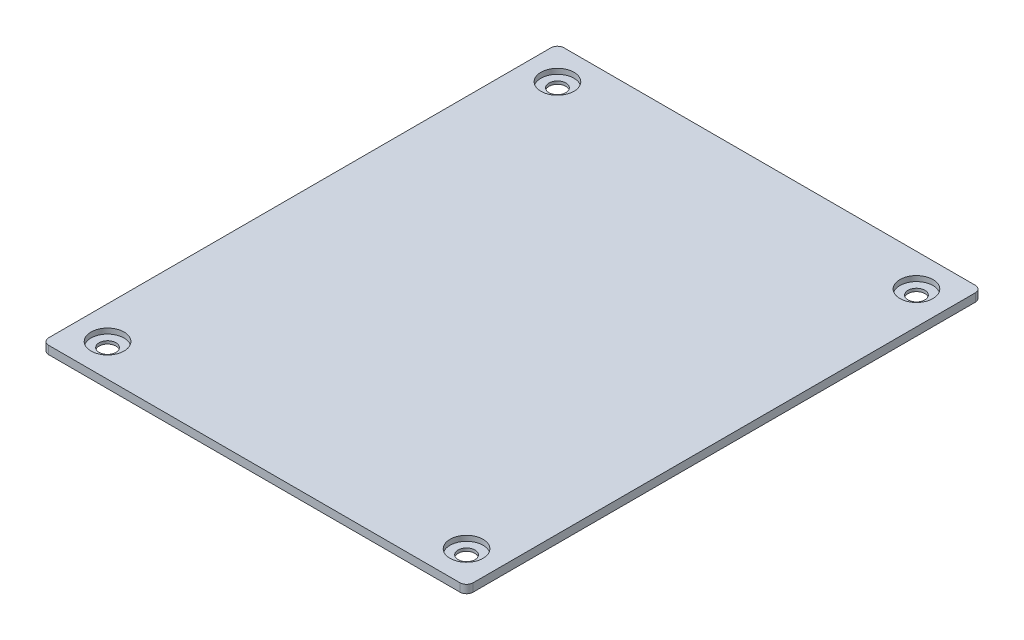
ISO-10303-21;
HEADER;
FILE_DESCRIPTION(('STEP AP214'),'2;1');
FILE_NAME('part.step','',(''),(''),'','','');
FILE_SCHEMA(('AUTOMOTIVE_DESIGN { 1 0 10303 214 1 1 1 1 }'));
ENDSEC;
DATA;
#1=APPLICATION_CONTEXT('core data for automotive mechanical design processes');
#2=APPLICATION_PROTOCOL_DEFINITION('international standard','automotive_design',2000,#1);
#3=PRODUCT_CONTEXT('',#1,'mechanical');
#4=PRODUCT('Part','Part','',(#3));
#5=PRODUCT_RELATED_PRODUCT_CATEGORY('part','',(#4));
#6=PRODUCT_DEFINITION_FORMATION('','',#4);
#7=PRODUCT_DEFINITION_CONTEXT('part definition',#1,'design');
#8=PRODUCT_DEFINITION('design','',#6,#7);
#9=PRODUCT_DEFINITION_SHAPE('','',#8);
#10=(LENGTH_UNIT() NAMED_UNIT(*) SI_UNIT(.MILLI.,.METRE.));
#11=(NAMED_UNIT(*) PLANE_ANGLE_UNIT() SI_UNIT($,.RADIAN.));
#12=(NAMED_UNIT(*) SI_UNIT($,.STERADIAN.) SOLID_ANGLE_UNIT());
#13=UNCERTAINTY_MEASURE_WITH_UNIT(LENGTH_MEASURE(1.E-05),#10,'distance_accuracy_value','');
#14=(GEOMETRIC_REPRESENTATION_CONTEXT(3) GLOBAL_UNCERTAINTY_ASSIGNED_CONTEXT((#13)) GLOBAL_UNIT_ASSIGNED_CONTEXT((#10,
#11,#12)) REPRESENTATION_CONTEXT('',''));
#15=CARTESIAN_POINT('',(0.,0.,0.));
#16=DIRECTION('',(0.,0.,1.));
#17=DIRECTION('',(1.,0.,0.));
#18=AXIS2_PLACEMENT_3D('',#15,#16,#17);
#19=CARTESIAN_POINT('',(82.423,3.175,100.076));
#20=DIRECTION('',(-1.,0.,0.));
#21=DIRECTION('',(0.,0.,1.));
#22=AXIS2_PLACEMENT_3D('',#19,#20,#21);
#23=PLANE('',#22);
#24=DIRECTION('',(0.,0.,-1.));
#25=VECTOR('',#24,1.);
#26=CARTESIAN_POINT('',(82.423,0.,100.076));
#27=LINE('',#26,#25);
#28=CARTESIAN_POINT('',(82.423,0.,97.536));
#29=VERTEX_POINT('',#28);
#30=CARTESIAN_POINT('',(82.423,0.,-97.536));
#31=VERTEX_POINT('',#30);
#32=EDGE_CURVE('E163',#29,#31,#27,.T.);
#33=ORIENTED_EDGE('',*,*,#32,.T.);
#34=DIRECTION('',(0.,-1.,0.));
#35=VECTOR('',#34,1.);
#36=CARTESIAN_POINT('',(82.423,3.175,-97.536));
#37=LINE('',#36,#35);
#38=CARTESIAN_POINT('',(82.423,3.175,-97.536));
#39=VERTEX_POINT('',#38);
#40=EDGE_CURVE('E11',#31,#39,#37,.F.);
#41=ORIENTED_EDGE('',*,*,#40,.T.);
#42=DIRECTION('',(0.,0.,-1.));
#43=VECTOR('',#42,1.);
#44=CARTESIAN_POINT('',(82.423,3.175,100.076));
#45=LINE('',#44,#43);
#46=CARTESIAN_POINT('',(82.423,3.175,97.536));
#47=VERTEX_POINT('',#46);
#48=EDGE_CURVE('E131',#47,#39,#45,.T.);
#49=ORIENTED_EDGE('',*,*,#48,.F.);
#50=DIRECTION('',(0.,-1.,0.));
#51=VECTOR('',#50,1.);
#52=CARTESIAN_POINT('',(82.423,3.175,97.536));
#53=LINE('',#52,#51);
#54=EDGE_CURVE('E47',#47,#29,#53,.T.);
#55=ORIENTED_EDGE('',*,*,#54,.T.);
#56=EDGE_LOOP('',(#33,#41,#49,#55));
#57=FACE_BOUND('',#56,.T.);
#58=ADVANCED_FACE('F39',(#57),#23,.F.);
#59=CARTESIAN_POINT('',(-82.423,3.175,-100.076));
#60=DIRECTION('',(0.,0.,1.));
#61=DIRECTION('',(1.,0.,0.));
#62=AXIS2_PLACEMENT_3D('',#59,#60,#61);
#63=PLANE('',#62);
#64=DIRECTION('',(-1.,0.,0.));
#65=VECTOR('',#64,1.);
#66=CARTESIAN_POINT('',(-82.423,0.,-100.076));
#67=LINE('',#66,#65);
#68=CARTESIAN_POINT('',(79.883,0.,-100.076));
#69=VERTEX_POINT('',#68);
#70=CARTESIAN_POINT('',(-79.883,0.,-100.076));
#71=VERTEX_POINT('',#70);
#72=EDGE_CURVE('E136',#69,#71,#67,.T.);
#73=ORIENTED_EDGE('',*,*,#72,.T.);
#74=DIRECTION('',(0.,-1.,0.));
#75=VECTOR('',#74,1.);
#76=CARTESIAN_POINT('',(-79.883,3.175,-100.076));
#77=LINE('',#76,#75);
#78=CARTESIAN_POINT('',(-79.883,3.175,-100.076));
#79=VERTEX_POINT('',#78);
#80=EDGE_CURVE('E54',#71,#79,#77,.F.);
#81=ORIENTED_EDGE('',*,*,#80,.T.);
#82=DIRECTION('',(-1.,0.,0.));
#83=VECTOR('',#82,1.);
#84=CARTESIAN_POINT('',(-82.423,3.175,-100.076));
#85=LINE('',#84,#83);
#86=CARTESIAN_POINT('',(79.883,3.175,-100.076));
#87=VERTEX_POINT('',#86);
#88=EDGE_CURVE('E134',#87,#79,#85,.T.);
#89=ORIENTED_EDGE('',*,*,#88,.F.);
#90=DIRECTION('',(0.,-1.,0.));
#91=VECTOR('',#90,1.);
#92=CARTESIAN_POINT('',(79.883,3.175,-100.076));
#93=LINE('',#92,#91);
#94=EDGE_CURVE('E155',#87,#69,#93,.T.);
#95=ORIENTED_EDGE('',*,*,#94,.T.);
#96=EDGE_LOOP('',(#73,#81,#89,#95));
#97=FACE_BOUND('',#96,.T.);
#98=ADVANCED_FACE('F242',(#97),#63,.F.);
#99=CARTESIAN_POINT('',(-82.423,3.175,100.076));
#100=DIRECTION('',(1.,0.,0.));
#101=DIRECTION('',(0.,0.,-1.));
#102=AXIS2_PLACEMENT_3D('',#99,#100,#101);
#103=PLANE('',#102);
#104=DIRECTION('',(0.,0.,1.));
#105=VECTOR('',#104,1.);
#106=CARTESIAN_POINT('',(-82.423,0.,100.076));
#107=LINE('',#106,#105);
#108=CARTESIAN_POINT('',(-82.423,0.,-97.536));
#109=VERTEX_POINT('',#108);
#110=CARTESIAN_POINT('',(-82.423,0.,97.536));
#111=VERTEX_POINT('',#110);
#112=EDGE_CURVE('E132',#109,#111,#107,.T.);
#113=ORIENTED_EDGE('',*,*,#112,.T.);
#114=DIRECTION('',(0.,-1.,0.));
#115=VECTOR('',#114,1.);
#116=CARTESIAN_POINT('',(-82.423,3.175,97.536));
#117=LINE('',#116,#115);
#118=CARTESIAN_POINT('',(-82.423,3.175,97.536));
#119=VERTEX_POINT('',#118);
#120=EDGE_CURVE('E110',#111,#119,#117,.F.);
#121=ORIENTED_EDGE('',*,*,#120,.T.);
#122=DIRECTION('',(0.,0.,1.));
#123=VECTOR('',#122,1.);
#124=CARTESIAN_POINT('',(-82.423,3.175,100.076));
#125=LINE('',#124,#123);
#126=CARTESIAN_POINT('',(-82.423,3.175,-97.536));
#127=VERTEX_POINT('',#126);
#128=EDGE_CURVE('E175',#127,#119,#125,.T.);
#129=ORIENTED_EDGE('',*,*,#128,.F.);
#130=DIRECTION('',(0.,-1.,0.));
#131=VECTOR('',#130,1.);
#132=CARTESIAN_POINT('',(-82.423,3.175,-97.536));
#133=LINE('',#132,#131);
#134=EDGE_CURVE('E115',#127,#109,#133,.T.);
#135=ORIENTED_EDGE('',*,*,#134,.T.);
#136=EDGE_LOOP('',(#113,#121,#129,#135));
#137=FACE_BOUND('',#136,.T.);
#138=ADVANCED_FACE('F239',(#137),#103,.F.);
#139=CARTESIAN_POINT('',(-82.423,3.175,100.076));
#140=DIRECTION('',(0.,0.,-1.));
#141=DIRECTION('',(-1.,0.,0.));
#142=AXIS2_PLACEMENT_3D('',#139,#140,#141);
#143=PLANE('',#142);
#144=DIRECTION('',(1.,0.,0.));
#145=VECTOR('',#144,1.);
#146=CARTESIAN_POINT('',(-82.423,3.175,100.076));
#147=LINE('',#146,#145);
#148=CARTESIAN_POINT('',(-79.883,3.175,100.076));
#149=VERTEX_POINT('',#148);
#150=CARTESIAN_POINT('',(79.883,3.175,100.076));
#151=VERTEX_POINT('',#150);
#152=EDGE_CURVE('E125',#149,#151,#147,.T.);
#153=ORIENTED_EDGE('',*,*,#152,.F.);
#154=DIRECTION('',(0.,-1.,0.));
#155=VECTOR('',#154,1.);
#156=CARTESIAN_POINT('',(-79.883,3.175,100.076));
#157=LINE('',#156,#155);
#158=CARTESIAN_POINT('',(-79.883,0.,100.076));
#159=VERTEX_POINT('',#158);
#160=EDGE_CURVE('E109',#149,#159,#157,.T.);
#161=ORIENTED_EDGE('',*,*,#160,.T.);
#162=DIRECTION('',(1.,0.,0.));
#163=VECTOR('',#162,1.);
#164=CARTESIAN_POINT('',(-82.423,0.,100.076));
#165=LINE('',#164,#163);
#166=CARTESIAN_POINT('',(79.883,0.,100.076));
#167=VERTEX_POINT('',#166);
#168=EDGE_CURVE('E122',#159,#167,#165,.T.);
#169=ORIENTED_EDGE('',*,*,#168,.T.);
#170=DIRECTION('',(0.,-1.,0.));
#171=VECTOR('',#170,1.);
#172=CARTESIAN_POINT('',(79.883,3.175,100.076));
#173=LINE('',#172,#171);
#174=EDGE_CURVE('E127',#167,#151,#173,.F.);
#175=ORIENTED_EDGE('',*,*,#174,.T.);
#176=EDGE_LOOP('',(#153,#161,#169,#175));
#177=FACE_BOUND('',#176,.T.);
#178=ADVANCED_FACE('F121',(#177),#143,.F.);
#179=CARTESIAN_POINT('',(0.,3.175,0.));
#180=DIRECTION('',(0.,-1.,0.));
#181=DIRECTION('',(0.,0.,-1.));
#182=AXIS2_PLACEMENT_3D('',#179,#180,#181);
#183=PLANE('',#182);
#184=CARTESIAN_POINT('',(-69.723,3.175,-87.376));
#185=DIRECTION('',(0.,1.,0.));
#186=DIRECTION('',(0.,0.,1.));
#187=AXIS2_PLACEMENT_3D('',#184,#185,#186);
#188=CIRCLE('',#187,6.4135);
#189=CARTESIAN_POINT('',(-69.723,3.175,-80.9625));
#190=VERTEX_POINT('',#189);
#191=EDGE_CURVE('E220',#190,#190,#188,.T.);
#192=ORIENTED_EDGE('',*,*,#191,.F.);
#193=EDGE_LOOP('',(#192));
#194=FACE_BOUND('',#193,.T.);
#195=CARTESIAN_POINT('',(69.723,3.175,87.376));
#196=DIRECTION('',(0.,1.,0.));
#197=DIRECTION('',(0.,0.,1.));
#198=AXIS2_PLACEMENT_3D('',#195,#196,#197);
#199=CIRCLE('',#198,6.4135);
#200=CARTESIAN_POINT('',(69.723,3.175,93.7895));
#201=VERTEX_POINT('',#200);
#202=EDGE_CURVE('E208',#201,#201,#199,.T.);
#203=ORIENTED_EDGE('',*,*,#202,.F.);
#204=EDGE_LOOP('',(#203));
#205=FACE_BOUND('',#204,.T.);
#206=CARTESIAN_POINT('',(69.723,3.175,-87.376));
#207=DIRECTION('',(0.,1.,0.));
#208=DIRECTION('',(0.,0.,1.));
#209=AXIS2_PLACEMENT_3D('',#206,#207,#208);
#210=CIRCLE('',#209,6.4135);
#211=CARTESIAN_POINT('',(69.723,3.175,-80.9625));
#212=VERTEX_POINT('',#211);
#213=EDGE_CURVE('E196',#212,#212,#210,.T.);
#214=ORIENTED_EDGE('',*,*,#213,.F.);
#215=EDGE_LOOP('',(#214));
#216=FACE_BOUND('',#215,.T.);
#217=CARTESIAN_POINT('',(-69.723,3.175,87.376));
#218=DIRECTION('',(0.,1.,0.));
#219=DIRECTION('',(0.,0.,1.));
#220=AXIS2_PLACEMENT_3D('',#217,#218,#219);
#221=CIRCLE('',#220,6.4135);
#222=CARTESIAN_POINT('',(-69.723,3.175,93.7895));
#223=VERTEX_POINT('',#222);
#224=EDGE_CURVE('E184',#223,#223,#221,.T.);
#225=ORIENTED_EDGE('',*,*,#224,.F.);
#226=EDGE_LOOP('',(#225));
#227=FACE_BOUND('',#226,.T.);
#228=ORIENTED_EDGE('',*,*,#128,.T.);
#229=CARTESIAN_POINT('',(-79.883,3.175,97.536));
#230=DIRECTION('',(0.,-1.,0.));
#231=DIRECTION('',(0.,0.,-1.));
#232=AXIS2_PLACEMENT_3D('',#229,#230,#231);
#233=CIRCLE('',#232,2.54);
#234=EDGE_CURVE('E153',#119,#149,#233,.F.);
#235=ORIENTED_EDGE('',*,*,#234,.T.);
#236=ORIENTED_EDGE('',*,*,#152,.T.);
#237=CARTESIAN_POINT('',(79.883,3.175,97.536));
#238=DIRECTION('',(0.,-1.,0.));
#239=DIRECTION('',(0.,0.,-1.));
#240=AXIS2_PLACEMENT_3D('',#237,#238,#239);
#241=CIRCLE('',#240,2.54);
#242=EDGE_CURVE('E148',#151,#47,#241,.F.);
#243=ORIENTED_EDGE('',*,*,#242,.T.);
#244=ORIENTED_EDGE('',*,*,#48,.T.);
#245=CARTESIAN_POINT('',(79.883,3.175,-97.536));
#246=DIRECTION('',(0.,-1.,0.));
#247=DIRECTION('',(0.,0.,-1.));
#248=AXIS2_PLACEMENT_3D('',#245,#246,#247);
#249=CIRCLE('',#248,2.54);
#250=EDGE_CURVE('E61',#39,#87,#249,.F.);
#251=ORIENTED_EDGE('',*,*,#250,.T.);
#252=ORIENTED_EDGE('',*,*,#88,.T.);
#253=CARTESIAN_POINT('',(-79.883,3.175,-97.536));
#254=DIRECTION('',(0.,-1.,0.));
#255=DIRECTION('',(0.,0.,-1.));
#256=AXIS2_PLACEMENT_3D('',#253,#254,#255);
#257=CIRCLE('',#256,2.54);
#258=EDGE_CURVE('E151',#79,#127,#257,.F.);
#259=ORIENTED_EDGE('',*,*,#258,.T.);
#260=EDGE_LOOP('',(#228,#235,#236,#243,#244,#251,#252,#259));
#261=FACE_BOUND('',#260,.T.);
#262=ADVANCED_FACE('F226',(#194,#205,#216,#227,#261),#183,.F.);
#263=CARTESIAN_POINT('',(0.,0.,0.));
#264=DIRECTION('',(0.,-1.,0.));
#265=DIRECTION('',(0.,0.,-1.));
#266=AXIS2_PLACEMENT_3D('',#263,#264,#265);
#267=PLANE('',#266);
#268=CARTESIAN_POINT('',(-69.723,0.,-87.376));
#269=DIRECTION('',(0.,1.,0.));
#270=DIRECTION('',(0.,0.,1.));
#271=AXIS2_PLACEMENT_3D('',#268,#269,#270);
#272=CIRCLE('',#271,3.2639);
#273=CARTESIAN_POINT('',(-69.723,0.,-84.1121));
#274=VERTEX_POINT('',#273);
#275=EDGE_CURVE('E211',#274,#274,#272,.T.);
#276=ORIENTED_EDGE('',*,*,#275,.T.);
#277=EDGE_LOOP('',(#276));
#278=FACE_BOUND('',#277,.T.);
#279=CARTESIAN_POINT('',(69.723,0.,87.376));
#280=DIRECTION('',(0.,1.,0.));
#281=DIRECTION('',(0.,0.,1.));
#282=AXIS2_PLACEMENT_3D('',#279,#280,#281);
#283=CIRCLE('',#282,3.2639);
#284=CARTESIAN_POINT('',(69.723,0.,90.6399));
#285=VERTEX_POINT('',#284);
#286=EDGE_CURVE('E199',#285,#285,#283,.T.);
#287=ORIENTED_EDGE('',*,*,#286,.T.);
#288=EDGE_LOOP('',(#287));
#289=FACE_BOUND('',#288,.T.);
#290=CARTESIAN_POINT('',(69.723,0.,-87.376));
#291=DIRECTION('',(0.,1.,0.));
#292=DIRECTION('',(0.,0.,1.));
#293=AXIS2_PLACEMENT_3D('',#290,#291,#292);
#294=CIRCLE('',#293,3.2639);
#295=CARTESIAN_POINT('',(69.723,0.,-84.1121));
#296=VERTEX_POINT('',#295);
#297=EDGE_CURVE('E187',#296,#296,#294,.T.);
#298=ORIENTED_EDGE('',*,*,#297,.T.);
#299=EDGE_LOOP('',(#298));
#300=FACE_BOUND('',#299,.T.);
#301=CARTESIAN_POINT('',(-69.723,0.,87.376));
#302=DIRECTION('',(0.,1.,0.));
#303=DIRECTION('',(0.,0.,1.));
#304=AXIS2_PLACEMENT_3D('',#301,#302,#303);
#305=CIRCLE('',#304,3.2639);
#306=CARTESIAN_POINT('',(-69.723,0.,90.6399));
#307=VERTEX_POINT('',#306);
#308=EDGE_CURVE('E168',#307,#307,#305,.T.);
#309=ORIENTED_EDGE('',*,*,#308,.T.);
#310=EDGE_LOOP('',(#309));
#311=FACE_BOUND('',#310,.T.);
#312=ORIENTED_EDGE('',*,*,#168,.F.);
#313=CARTESIAN_POINT('',(-79.883,0.,97.536));
#314=DIRECTION('',(0.,-1.,0.));
#315=DIRECTION('',(0.,0.,-1.));
#316=AXIS2_PLACEMENT_3D('',#313,#314,#315);
#317=CIRCLE('',#316,2.54);
#318=EDGE_CURVE('E105',#159,#111,#317,.T.);
#319=ORIENTED_EDGE('',*,*,#318,.T.);
#320=ORIENTED_EDGE('',*,*,#112,.F.);
#321=CARTESIAN_POINT('',(-79.883,0.,-97.536));
#322=DIRECTION('',(0.,-1.,0.));
#323=DIRECTION('',(0.,0.,-1.));
#324=AXIS2_PLACEMENT_3D('',#321,#322,#323);
#325=CIRCLE('',#324,2.54);
#326=EDGE_CURVE('E116',#109,#71,#325,.T.);
#327=ORIENTED_EDGE('',*,*,#326,.T.);
#328=ORIENTED_EDGE('',*,*,#72,.F.);
#329=CARTESIAN_POINT('',(79.883,0.,-97.536));
#330=DIRECTION('',(0.,-1.,0.));
#331=DIRECTION('',(0.,0.,-1.));
#332=AXIS2_PLACEMENT_3D('',#329,#330,#331);
#333=CIRCLE('',#332,2.54);
#334=EDGE_CURVE('E142',#69,#31,#333,.T.);
#335=ORIENTED_EDGE('',*,*,#334,.T.);
#336=ORIENTED_EDGE('',*,*,#32,.F.);
#337=CARTESIAN_POINT('',(79.883,0.,97.536));
#338=DIRECTION('',(0.,-1.,0.));
#339=DIRECTION('',(0.,0.,-1.));
#340=AXIS2_PLACEMENT_3D('',#337,#338,#339);
#341=CIRCLE('',#340,2.54);
#342=EDGE_CURVE('E126',#29,#167,#341,.T.);
#343=ORIENTED_EDGE('',*,*,#342,.T.);
#344=EDGE_LOOP('',(#312,#319,#320,#327,#328,#335,#336,#343));
#345=FACE_BOUND('',#344,.T.);
#346=ADVANCED_FACE('F129',(#278,#289,#300,#311,#345),#267,.T.);
#347=CARTESIAN_POINT('',(-69.723,3.175,87.376));
#348=DIRECTION('',(0.,1.,0.));
#349=DIRECTION('',(0.,0.,1.));
#350=AXIS2_PLACEMENT_3D('',#347,#348,#349);
#351=CYLINDRICAL_SURFACE('',#350,3.2639);
#352=ORIENTED_EDGE('',*,*,#308,.F.);
#353=EDGE_LOOP('',(#352));
#354=FACE_BOUND('',#353,.T.);
#355=CARTESIAN_POINT('',(-69.723,1.143,87.376));
#356=DIRECTION('',(0.,1.,0.));
#357=DIRECTION('',(0.,0.,1.));
#358=AXIS2_PLACEMENT_3D('',#355,#356,#357);
#359=CIRCLE('',#358,3.2639);
#360=CARTESIAN_POINT('',(-69.723,1.143,90.6399));
#361=VERTEX_POINT('',#360);
#362=EDGE_CURVE('E171',#361,#361,#359,.T.);
#363=ORIENTED_EDGE('',*,*,#362,.T.);
#364=EDGE_LOOP('',(#363));
#365=FACE_BOUND('',#364,.T.);
#366=ADVANCED_FACE('F296',(#354,#365),#351,.F.);
#367=CARTESIAN_POINT('',(-66.4591,1.143,87.376));
#368=DIRECTION('',(0.,-1.,0.));
#369=DIRECTION('',(0.,0.,-1.));
#370=AXIS2_PLACEMENT_3D('',#367,#368,#369);
#371=PLANE('',#370);
#372=ORIENTED_EDGE('',*,*,#362,.F.);
#373=EDGE_LOOP('',(#372));
#374=FACE_BOUND('',#373,.T.);
#375=CARTESIAN_POINT('',(-69.723,1.143,87.376));
#376=DIRECTION('',(0.,1.,0.));
#377=DIRECTION('',(0.,0.,1.));
#378=AXIS2_PLACEMENT_3D('',#375,#376,#377);
#379=CIRCLE('',#378,6.4135);
#380=CARTESIAN_POINT('',(-69.723,1.143,93.7895));
#381=VERTEX_POINT('',#380);
#382=EDGE_CURVE('E181',#381,#381,#379,.T.);
#383=ORIENTED_EDGE('',*,*,#382,.T.);
#384=EDGE_LOOP('',(#383));
#385=FACE_BOUND('',#384,.T.);
#386=ADVANCED_FACE('F337',(#374,#385),#371,.F.);
#387=CARTESIAN_POINT('',(-69.723,3.175,87.376));
#388=DIRECTION('',(0.,1.,0.));
#389=DIRECTION('',(0.,0.,1.));
#390=AXIS2_PLACEMENT_3D('',#387,#388,#389);
#391=CYLINDRICAL_SURFACE('',#390,6.4135);
#392=ORIENTED_EDGE('',*,*,#382,.F.);
#393=EDGE_LOOP('',(#392));
#394=FACE_BOUND('',#393,.T.);
#395=ORIENTED_EDGE('',*,*,#224,.T.);
#396=EDGE_LOOP('',(#395));
#397=FACE_BOUND('',#396,.T.);
#398=ADVANCED_FACE('F347',(#394,#397),#391,.F.);
#399=CARTESIAN_POINT('',(69.723,3.175,-87.376));
#400=DIRECTION('',(0.,1.,0.));
#401=DIRECTION('',(0.,0.,1.));
#402=AXIS2_PLACEMENT_3D('',#399,#400,#401);
#403=CYLINDRICAL_SURFACE('',#402,3.2639);
#404=ORIENTED_EDGE('',*,*,#297,.F.);
#405=EDGE_LOOP('',(#404));
#406=FACE_BOUND('',#405,.T.);
#407=CARTESIAN_POINT('',(69.723,1.143,-87.376));
#408=DIRECTION('',(0.,1.,0.));
#409=DIRECTION('',(0.,0.,1.));
#410=AXIS2_PLACEMENT_3D('',#407,#408,#409);
#411=CIRCLE('',#410,3.2639);
#412=CARTESIAN_POINT('',(69.723,1.143,-84.1121));
#413=VERTEX_POINT('',#412);
#414=EDGE_CURVE('E190',#413,#413,#411,.T.);
#415=ORIENTED_EDGE('',*,*,#414,.T.);
#416=EDGE_LOOP('',(#415));
#417=FACE_BOUND('',#416,.T.);
#418=ADVANCED_FACE('F357',(#406,#417),#403,.F.);
#419=CARTESIAN_POINT('',(72.9869,1.143,-87.376));
#420=DIRECTION('',(0.,-1.,0.));
#421=DIRECTION('',(0.,0.,-1.));
#422=AXIS2_PLACEMENT_3D('',#419,#420,#421);
#423=PLANE('',#422);
#424=ORIENTED_EDGE('',*,*,#414,.F.);
#425=EDGE_LOOP('',(#424));
#426=FACE_BOUND('',#425,.T.);
#427=CARTESIAN_POINT('',(69.723,1.143,-87.376));
#428=DIRECTION('',(0.,1.,0.));
#429=DIRECTION('',(0.,0.,1.));
#430=AXIS2_PLACEMENT_3D('',#427,#428,#429);
#431=CIRCLE('',#430,6.4135);
#432=CARTESIAN_POINT('',(69.723,1.143,-80.9625));
#433=VERTEX_POINT('',#432);
#434=EDGE_CURVE('E193',#433,#433,#431,.T.);
#435=ORIENTED_EDGE('',*,*,#434,.T.);
#436=EDGE_LOOP('',(#435));
#437=FACE_BOUND('',#436,.T.);
#438=ADVANCED_FACE('F367',(#426,#437),#423,.F.);
#439=CARTESIAN_POINT('',(69.723,3.175,-87.376));
#440=DIRECTION('',(0.,1.,0.));
#441=DIRECTION('',(0.,0.,1.));
#442=AXIS2_PLACEMENT_3D('',#439,#440,#441);
#443=CYLINDRICAL_SURFACE('',#442,6.4135);
#444=ORIENTED_EDGE('',*,*,#434,.F.);
#445=EDGE_LOOP('',(#444));
#446=FACE_BOUND('',#445,.T.);
#447=ORIENTED_EDGE('',*,*,#213,.T.);
#448=EDGE_LOOP('',(#447));
#449=FACE_BOUND('',#448,.T.);
#450=ADVANCED_FACE('F377',(#446,#449),#443,.F.);
#451=CARTESIAN_POINT('',(69.723,3.175,87.376));
#452=DIRECTION('',(0.,1.,0.));
#453=DIRECTION('',(0.,0.,1.));
#454=AXIS2_PLACEMENT_3D('',#451,#452,#453);
#455=CYLINDRICAL_SURFACE('',#454,3.2639);
#456=ORIENTED_EDGE('',*,*,#286,.F.);
#457=EDGE_LOOP('',(#456));
#458=FACE_BOUND('',#457,.T.);
#459=CARTESIAN_POINT('',(69.723,1.143,87.376));
#460=DIRECTION('',(0.,1.,0.));
#461=DIRECTION('',(0.,0.,1.));
#462=AXIS2_PLACEMENT_3D('',#459,#460,#461);
#463=CIRCLE('',#462,3.2639);
#464=CARTESIAN_POINT('',(69.723,1.143,90.6399));
#465=VERTEX_POINT('',#464);
#466=EDGE_CURVE('E202',#465,#465,#463,.T.);
#467=ORIENTED_EDGE('',*,*,#466,.T.);
#468=EDGE_LOOP('',(#467));
#469=FACE_BOUND('',#468,.T.);
#470=ADVANCED_FACE('F387',(#458,#469),#455,.F.);
#471=CARTESIAN_POINT('',(72.9869,1.143,87.376));
#472=DIRECTION('',(0.,-1.,0.));
#473=DIRECTION('',(0.,0.,-1.));
#474=AXIS2_PLACEMENT_3D('',#471,#472,#473);
#475=PLANE('',#474);
#476=ORIENTED_EDGE('',*,*,#466,.F.);
#477=EDGE_LOOP('',(#476));
#478=FACE_BOUND('',#477,.T.);
#479=CARTESIAN_POINT('',(69.723,1.143,87.376));
#480=DIRECTION('',(0.,1.,0.));
#481=DIRECTION('',(0.,0.,1.));
#482=AXIS2_PLACEMENT_3D('',#479,#480,#481);
#483=CIRCLE('',#482,6.4135);
#484=CARTESIAN_POINT('',(69.723,1.143,93.7895));
#485=VERTEX_POINT('',#484);
#486=EDGE_CURVE('E205',#485,#485,#483,.T.);
#487=ORIENTED_EDGE('',*,*,#486,.T.);
#488=EDGE_LOOP('',(#487));
#489=FACE_BOUND('',#488,.T.);
#490=ADVANCED_FACE('F397',(#478,#489),#475,.F.);
#491=CARTESIAN_POINT('',(69.723,3.175,87.376));
#492=DIRECTION('',(0.,1.,0.));
#493=DIRECTION('',(0.,0.,1.));
#494=AXIS2_PLACEMENT_3D('',#491,#492,#493);
#495=CYLINDRICAL_SURFACE('',#494,6.4135);
#496=ORIENTED_EDGE('',*,*,#486,.F.);
#497=EDGE_LOOP('',(#496));
#498=FACE_BOUND('',#497,.T.);
#499=ORIENTED_EDGE('',*,*,#202,.T.);
#500=EDGE_LOOP('',(#499));
#501=FACE_BOUND('',#500,.T.);
#502=ADVANCED_FACE('F407',(#498,#501),#495,.F.);
#503=CARTESIAN_POINT('',(-69.723,3.175,-87.376));
#504=DIRECTION('',(0.,1.,0.));
#505=DIRECTION('',(0.,0.,1.));
#506=AXIS2_PLACEMENT_3D('',#503,#504,#505);
#507=CYLINDRICAL_SURFACE('',#506,3.2639);
#508=ORIENTED_EDGE('',*,*,#275,.F.);
#509=EDGE_LOOP('',(#508));
#510=FACE_BOUND('',#509,.T.);
#511=CARTESIAN_POINT('',(-69.723,1.143,-87.376));
#512=DIRECTION('',(0.,1.,0.));
#513=DIRECTION('',(0.,0.,1.));
#514=AXIS2_PLACEMENT_3D('',#511,#512,#513);
#515=CIRCLE('',#514,3.2639);
#516=CARTESIAN_POINT('',(-69.723,1.143,-84.1121));
#517=VERTEX_POINT('',#516);
#518=EDGE_CURVE('E214',#517,#517,#515,.T.);
#519=ORIENTED_EDGE('',*,*,#518,.T.);
#520=EDGE_LOOP('',(#519));
#521=FACE_BOUND('',#520,.T.);
#522=ADVANCED_FACE('F417',(#510,#521),#507,.F.);
#523=CARTESIAN_POINT('',(-66.4591,1.143,-87.376));
#524=DIRECTION('',(0.,-1.,0.));
#525=DIRECTION('',(0.,0.,-1.));
#526=AXIS2_PLACEMENT_3D('',#523,#524,#525);
#527=PLANE('',#526);
#528=ORIENTED_EDGE('',*,*,#518,.F.);
#529=EDGE_LOOP('',(#528));
#530=FACE_BOUND('',#529,.T.);
#531=CARTESIAN_POINT('',(-69.723,1.143,-87.376));
#532=DIRECTION('',(0.,1.,0.));
#533=DIRECTION('',(0.,0.,1.));
#534=AXIS2_PLACEMENT_3D('',#531,#532,#533);
#535=CIRCLE('',#534,6.4135);
#536=CARTESIAN_POINT('',(-69.723,1.143,-80.9625));
#537=VERTEX_POINT('',#536);
#538=EDGE_CURVE('E217',#537,#537,#535,.T.);
#539=ORIENTED_EDGE('',*,*,#538,.T.);
#540=EDGE_LOOP('',(#539));
#541=FACE_BOUND('',#540,.T.);
#542=ADVANCED_FACE('F427',(#530,#541),#527,.F.);
#543=CARTESIAN_POINT('',(-69.723,3.175,-87.376));
#544=DIRECTION('',(0.,1.,0.));
#545=DIRECTION('',(0.,0.,1.));
#546=AXIS2_PLACEMENT_3D('',#543,#544,#545);
#547=CYLINDRICAL_SURFACE('',#546,6.4135);
#548=ORIENTED_EDGE('',*,*,#538,.F.);
#549=EDGE_LOOP('',(#548));
#550=FACE_BOUND('',#549,.T.);
#551=ORIENTED_EDGE('',*,*,#191,.T.);
#552=EDGE_LOOP('',(#551));
#553=FACE_BOUND('',#552,.T.);
#554=ADVANCED_FACE('F224',(#550,#553),#547,.F.);
#555=CARTESIAN_POINT('',(-79.883,3.175,97.536));
#556=DIRECTION('',(0.,-1.,0.));
#557=DIRECTION('',(0.,0.,-1.));
#558=AXIS2_PLACEMENT_3D('',#555,#556,#557);
#559=CYLINDRICAL_SURFACE('',#558,2.54);
#560=ORIENTED_EDGE('',*,*,#234,.F.);
#561=ORIENTED_EDGE('',*,*,#120,.F.);
#562=ORIENTED_EDGE('',*,*,#318,.F.);
#563=ORIENTED_EDGE('',*,*,#160,.F.);
#564=EDGE_LOOP('',(#560,#561,#562,#563));
#565=FACE_BOUND('',#564,.T.);
#566=ADVANCED_FACE('F108',(#565),#559,.T.);
#567=CARTESIAN_POINT('',(-79.883,3.175,-97.536));
#568=DIRECTION('',(0.,-1.,0.));
#569=DIRECTION('',(0.,0.,-1.));
#570=AXIS2_PLACEMENT_3D('',#567,#568,#569);
#571=CYLINDRICAL_SURFACE('',#570,2.54);
#572=ORIENTED_EDGE('',*,*,#258,.F.);
#573=ORIENTED_EDGE('',*,*,#80,.F.);
#574=ORIENTED_EDGE('',*,*,#326,.F.);
#575=ORIENTED_EDGE('',*,*,#134,.F.);
#576=EDGE_LOOP('',(#572,#573,#574,#575));
#577=FACE_BOUND('',#576,.T.);
#578=ADVANCED_FACE('F241',(#577),#571,.T.);
#579=CARTESIAN_POINT('',(79.883,3.175,-97.536));
#580=DIRECTION('',(0.,-1.,0.));
#581=DIRECTION('',(0.,0.,-1.));
#582=AXIS2_PLACEMENT_3D('',#579,#580,#581);
#583=CYLINDRICAL_SURFACE('',#582,2.54);
#584=ORIENTED_EDGE('',*,*,#250,.F.);
#585=ORIENTED_EDGE('',*,*,#40,.F.);
#586=ORIENTED_EDGE('',*,*,#334,.F.);
#587=ORIENTED_EDGE('',*,*,#94,.F.);
#588=EDGE_LOOP('',(#584,#585,#586,#587));
#589=FACE_BOUND('',#588,.T.);
#590=ADVANCED_FACE('F245',(#589),#583,.T.);
#591=CARTESIAN_POINT('',(79.883,3.175,97.536));
#592=DIRECTION('',(0.,-1.,0.));
#593=DIRECTION('',(0.,0.,-1.));
#594=AXIS2_PLACEMENT_3D('',#591,#592,#593);
#595=CYLINDRICAL_SURFACE('',#594,2.54);
#596=ORIENTED_EDGE('',*,*,#242,.F.);
#597=ORIENTED_EDGE('',*,*,#174,.F.);
#598=ORIENTED_EDGE('',*,*,#342,.F.);
#599=ORIENTED_EDGE('',*,*,#54,.F.);
#600=EDGE_LOOP('',(#596,#597,#598,#599));
#601=FACE_BOUND('',#600,.T.);
#602=ADVANCED_FACE('F41',(#601),#595,.T.);
#603=CLOSED_SHELL('',(#58,#98,#138,#178,#262,#346,#366,#386,#398,#418,#438,#450,#470,#490,#502,
#522,#542,#554,#566,#578,#590,#602));
#604=MANIFOLD_SOLID_BREP('B2',#603);
#605=ADVANCED_BREP_SHAPE_REPRESENTATION('',(#18,#604),#14);
#606=SHAPE_DEFINITION_REPRESENTATION(#9,#605);
ENDSEC;
END-ISO-10303-21;
